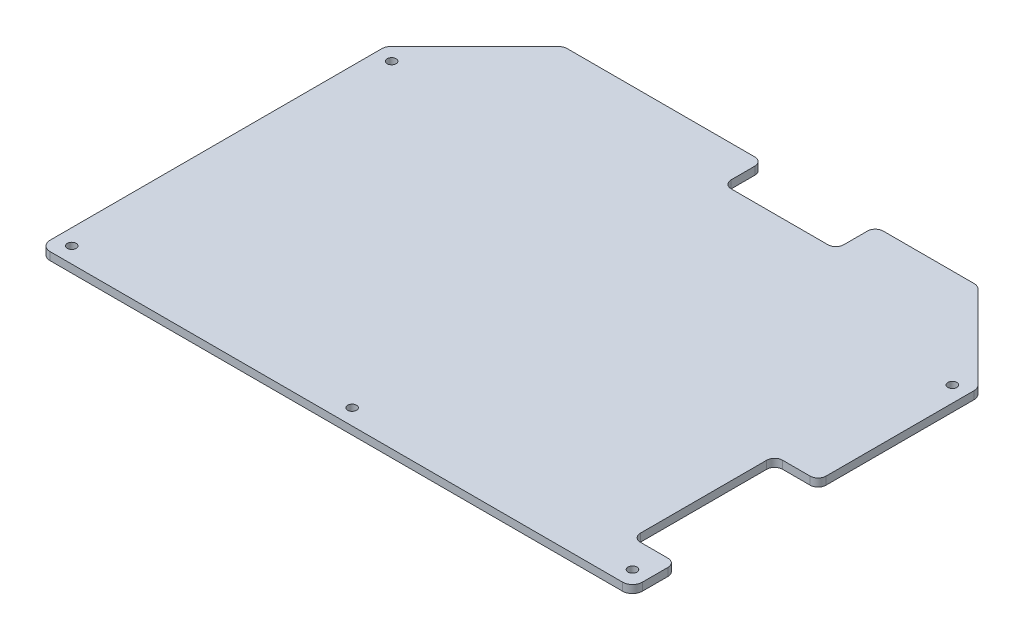
ISO-10303-21;
HEADER;
FILE_DESCRIPTION(('STEP AP214'),'2;1');
FILE_NAME('part.step','',(''),(''),'','','');
FILE_SCHEMA(('AUTOMOTIVE_DESIGN { 1 0 10303 214 1 1 1 1 }'));
ENDSEC;
DATA;
#1=APPLICATION_CONTEXT('core data for automotive mechanical design processes');
#2=APPLICATION_PROTOCOL_DEFINITION('international standard','automotive_design',2000,#1);
#3=PRODUCT_CONTEXT('',#1,'mechanical');
#4=PRODUCT('Part','Part','',(#3));
#5=PRODUCT_RELATED_PRODUCT_CATEGORY('part','',(#4));
#6=PRODUCT_DEFINITION_FORMATION('','',#4);
#7=PRODUCT_DEFINITION_CONTEXT('part definition',#1,'design');
#8=PRODUCT_DEFINITION('design','',#6,#7);
#9=PRODUCT_DEFINITION_SHAPE('','',#8);
#10=(LENGTH_UNIT() NAMED_UNIT(*) SI_UNIT(.MILLI.,.METRE.));
#11=(NAMED_UNIT(*) PLANE_ANGLE_UNIT() SI_UNIT($,.RADIAN.));
#12=(NAMED_UNIT(*) SI_UNIT($,.STERADIAN.) SOLID_ANGLE_UNIT());
#13=UNCERTAINTY_MEASURE_WITH_UNIT(LENGTH_MEASURE(1.E-05),#10,'distance_accuracy_value','');
#14=(GEOMETRIC_REPRESENTATION_CONTEXT(3) GLOBAL_UNCERTAINTY_ASSIGNED_CONTEXT((#13)) GLOBAL_UNIT_ASSIGNED_CONTEXT((#10,
#11,#12)) REPRESENTATION_CONTEXT('',''));
#15=CARTESIAN_POINT('',(0.,0.,0.));
#16=DIRECTION('',(0.,0.,1.));
#17=DIRECTION('',(1.,0.,0.));
#18=AXIS2_PLACEMENT_3D('',#15,#16,#17);
#19=CARTESIAN_POINT('',(105.,4.,-220.));
#20=DIRECTION('',(0.,0.,1.));
#21=DIRECTION('',(1.,0.,0.));
#22=AXIS2_PLACEMENT_3D('',#19,#20,#21);
#23=PLANE('',#22);
#24=DIRECTION('',(-1.,0.,0.));
#25=VECTOR('',#24,1.);
#26=CARTESIAN_POINT('',(105.,0.,-220.));
#27=LINE('',#26,#25);
#28=CARTESIAN_POINT('',(102.928932188135,0.,-220.));
#29=VERTEX_POINT('',#28);
#30=CARTESIAN_POINT('',(57.,0.,-220.));
#31=VERTEX_POINT('',#30);
#32=EDGE_CURVE('E564',#29,#31,#27,.T.);
#33=ORIENTED_EDGE('',*,*,#32,.T.);
#34=DIRECTION('',(0.,1.,0.));
#35=VECTOR('',#34,1.);
#36=CARTESIAN_POINT('',(57.,4.,-220.));
#37=LINE('',#36,#35);
#38=CARTESIAN_POINT('',(57.,4.,-220.));
#39=VERTEX_POINT('',#38);
#40=EDGE_CURVE('E335',#31,#39,#37,.T.);
#41=ORIENTED_EDGE('',*,*,#40,.T.);
#42=DIRECTION('',(-1.,0.,0.));
#43=VECTOR('',#42,1.);
#44=CARTESIAN_POINT('',(105.,4.,-220.));
#45=LINE('',#44,#43);
#46=CARTESIAN_POINT('',(102.928932188135,4.,-220.));
#47=VERTEX_POINT('',#46);
#48=EDGE_CURVE('E542',#47,#39,#45,.T.);
#49=ORIENTED_EDGE('',*,*,#48,.F.);
#50=DIRECTION('',(0.,-1.,0.));
#51=VECTOR('',#50,1.);
#52=CARTESIAN_POINT('',(102.928932188135,4.,-220.));
#53=LINE('',#52,#51);
#54=EDGE_CURVE('E324',#47,#29,#53,.T.);
#55=ORIENTED_EDGE('',*,*,#54,.T.);
#56=EDGE_LOOP('',(#33,#41,#49,#55));
#57=FACE_BOUND('',#56,.T.);
#58=ADVANCED_FACE('F38',(#57),#23,.F.);
#59=CARTESIAN_POINT('',(150.,4.,0.));
#60=DIRECTION('',(-1.,0.,0.));
#61=DIRECTION('',(0.,0.,1.));
#62=AXIS2_PLACEMENT_3D('',#59,#60,#61);
#63=PLANE('',#62);
#64=DIRECTION('',(0.,0.,-1.));
#65=VECTOR('',#64,1.);
#66=CARTESIAN_POINT('',(150.,0.,0.));
#67=LINE('',#66,#65);
#68=CARTESIAN_POINT('',(150.,0.,-5.));
#69=VERTEX_POINT('',#68);
#70=CARTESIAN_POINT('',(150.,0.,-18.));
#71=VERTEX_POINT('',#70);
#72=EDGE_CURVE('E555',#69,#71,#67,.T.);
#73=ORIENTED_EDGE('',*,*,#72,.T.);
#74=DIRECTION('',(0.,1.,0.));
#75=VECTOR('',#74,1.);
#76=CARTESIAN_POINT('',(150.,4.,-18.));
#77=LINE('',#76,#75);
#78=CARTESIAN_POINT('',(150.,4.,-18.));
#79=VERTEX_POINT('',#78);
#80=EDGE_CURVE('E378',#71,#79,#77,.T.);
#81=ORIENTED_EDGE('',*,*,#80,.T.);
#82=DIRECTION('',(0.,0.,-1.));
#83=VECTOR('',#82,1.);
#84=CARTESIAN_POINT('',(150.,4.,0.));
#85=LINE('',#84,#83);
#86=CARTESIAN_POINT('',(150.,4.,-5.));
#87=VERTEX_POINT('',#86);
#88=EDGE_CURVE('E260',#87,#79,#85,.T.);
#89=ORIENTED_EDGE('',*,*,#88,.F.);
#90=DIRECTION('',(0.,-1.,0.));
#91=VECTOR('',#90,1.);
#92=CARTESIAN_POINT('',(150.,4.,-5.));
#93=LINE('',#92,#91);
#94=EDGE_CURVE('E312',#87,#69,#93,.T.);
#95=ORIENTED_EDGE('',*,*,#94,.T.);
#96=EDGE_LOOP('',(#73,#81,#89,#95));
#97=FACE_BOUND('',#96,.T.);
#98=ADVANCED_FACE('F592',(#97),#63,.F.);
#99=CARTESIAN_POINT('',(150.,4.,-98.));
#100=VERTEX_POINT('',#99);
#101=CARTESIAN_POINT('',(150.,4.,-172.928932188135));
#102=VERTEX_POINT('',#101);
#103=EDGE_CURVE('E255',#100,#102,#85,.T.);
#104=ORIENTED_EDGE('',*,*,#103,.F.);
#105=DIRECTION('',(0.,1.,0.));
#106=VECTOR('',#105,1.);
#107=CARTESIAN_POINT('',(150.,4.,-98.));
#108=LINE('',#107,#106);
#109=CARTESIAN_POINT('',(150.,0.,-98.));
#110=VERTEX_POINT('',#109);
#111=EDGE_CURVE('E396',#100,#110,#108,.F.);
#112=ORIENTED_EDGE('',*,*,#111,.T.);
#113=CARTESIAN_POINT('',(150.,0.,-172.928932188135));
#114=VERTEX_POINT('',#113);
#115=EDGE_CURVE('E533',#110,#114,#67,.T.);
#116=ORIENTED_EDGE('',*,*,#115,.T.);
#117=DIRECTION('',(0.,-1.,0.));
#118=VECTOR('',#117,1.);
#119=CARTESIAN_POINT('',(150.,4.,-172.928932188135));
#120=LINE('',#119,#118);
#121=EDGE_CURVE('E316',#114,#102,#120,.F.);
#122=ORIENTED_EDGE('',*,*,#121,.T.);
#123=EDGE_LOOP('',(#104,#112,#116,#122));
#124=FACE_BOUND('',#123,.T.);
#125=ADVANCED_FACE('F598',(#124),#63,.F.);
#126=CARTESIAN_POINT('',(150.,4.,-175.));
#127=DIRECTION('',(-0.707106781186547,0.,0.707106781186548));
#128=DIRECTION('',(0.707106781186548,0.,0.707106781186547));
#129=AXIS2_PLACEMENT_3D('',#126,#127,#128);
#130=PLANE('',#129);
#131=DIRECTION('',(-0.707106781186548,0.,-0.707106781186547));
#132=VECTOR('',#131,1.);
#133=CARTESIAN_POINT('',(150.,4.,-175.));
#134=LINE('',#133,#132);
#135=CARTESIAN_POINT('',(148.535533905933,4.,-176.464466094067));
#136=VERTEX_POINT('',#135);
#137=CARTESIAN_POINT('',(106.464466094067,4.,-218.535533905933));
#138=VERTEX_POINT('',#137);
#139=EDGE_CURVE('E537',#136,#138,#134,.T.);
#140=ORIENTED_EDGE('',*,*,#139,.F.);
#141=DIRECTION('',(0.,-1.,0.));
#142=VECTOR('',#141,1.);
#143=CARTESIAN_POINT('',(148.535533905933,4.,-176.464466094067));
#144=LINE('',#143,#142);
#145=CARTESIAN_POINT('',(148.535533905933,0.,-176.464466094067));
#146=VERTEX_POINT('',#145);
#147=EDGE_CURVE('E308',#136,#146,#144,.T.);
#148=ORIENTED_EDGE('',*,*,#147,.T.);
#149=DIRECTION('',(-0.707106781186548,0.,-0.707106781186547));
#150=VECTOR('',#149,1.);
#151=CARTESIAN_POINT('',(150.,0.,-175.));
#152=LINE('',#151,#150);
#153=CARTESIAN_POINT('',(106.464466094067,0.,-218.535533905933));
#154=VERTEX_POINT('',#153);
#155=EDGE_CURVE('E559',#146,#154,#152,.T.);
#156=ORIENTED_EDGE('',*,*,#155,.T.);
#157=DIRECTION('',(0.,-1.,0.));
#158=VECTOR('',#157,1.);
#159=CARTESIAN_POINT('',(106.464466094067,4.,-218.535533905933));
#160=LINE('',#159,#158);
#161=EDGE_CURVE('E305',#154,#138,#160,.F.);
#162=ORIENTED_EDGE('',*,*,#161,.T.);
#163=EDGE_LOOP('',(#140,#148,#156,#162));
#164=FACE_BOUND('',#163,.T.);
#165=ADVANCED_FACE('F603',(#164),#130,.F.);
#166=CARTESIAN_POINT('',(-8.00000000000001,4.,-220.));
#167=VERTEX_POINT('',#166);
#168=CARTESIAN_POINT('',(-102.928932188135,4.,-220.));
#169=VERTEX_POINT('',#168);
#170=EDGE_CURVE('E541',#167,#169,#45,.T.);
#171=ORIENTED_EDGE('',*,*,#170,.F.);
#172=DIRECTION('',(0.,1.,0.));
#173=VECTOR('',#172,1.);
#174=CARTESIAN_POINT('',(-8.00000000000001,4.,-220.));
#175=LINE('',#174,#173);
#176=CARTESIAN_POINT('',(-8.00000000000001,0.,-220.));
#177=VERTEX_POINT('',#176);
#178=EDGE_CURVE('E375',#167,#177,#175,.F.);
#179=ORIENTED_EDGE('',*,*,#178,.T.);
#180=CARTESIAN_POINT('',(-102.928932188135,0.,-220.));
#181=VERTEX_POINT('',#180);
#182=EDGE_CURVE('E563',#177,#181,#27,.T.);
#183=ORIENTED_EDGE('',*,*,#182,.T.);
#184=DIRECTION('',(0.,-1.,0.));
#185=VECTOR('',#184,1.);
#186=CARTESIAN_POINT('',(-102.928932188135,4.,-220.));
#187=LINE('',#186,#185);
#188=EDGE_CURVE('E320',#181,#169,#187,.F.);
#189=ORIENTED_EDGE('',*,*,#188,.T.);
#190=EDGE_LOOP('',(#171,#179,#183,#189));
#191=FACE_BOUND('',#190,.T.);
#192=ADVANCED_FACE('F589',(#191),#23,.F.);
#193=CARTESIAN_POINT('',(-150.,4.,-175.));
#194=DIRECTION('',(0.707106781186547,0.,0.707106781186548));
#195=DIRECTION('',(0.707106781186548,0.,-0.707106781186547));
#196=AXIS2_PLACEMENT_3D('',#193,#194,#195);
#197=PLANE('',#196);
#198=DIRECTION('',(-0.707106781186548,0.,0.707106781186547));
#199=VECTOR('',#198,1.);
#200=CARTESIAN_POINT('',(-150.,4.,-175.));
#201=LINE('',#200,#199);
#202=CARTESIAN_POINT('',(-106.464466094067,4.,-218.535533905933));
#203=VERTEX_POINT('',#202);
#204=CARTESIAN_POINT('',(-148.535533905933,4.,-176.464466094067));
#205=VERTEX_POINT('',#204);
#206=EDGE_CURVE('E545',#203,#205,#201,.T.);
#207=ORIENTED_EDGE('',*,*,#206,.F.);
#208=DIRECTION('',(0.,-1.,0.));
#209=VECTOR('',#208,1.);
#210=CARTESIAN_POINT('',(-106.464466094067,4.,-218.535533905933));
#211=LINE('',#210,#209);
#212=CARTESIAN_POINT('',(-106.464466094067,0.,-218.535533905933));
#213=VERTEX_POINT('',#212);
#214=EDGE_CURVE('E331',#203,#213,#211,.T.);
#215=ORIENTED_EDGE('',*,*,#214,.T.);
#216=DIRECTION('',(-0.707106781186548,0.,0.707106781186547));
#217=VECTOR('',#216,1.);
#218=CARTESIAN_POINT('',(-150.,0.,-175.));
#219=LINE('',#218,#217);
#220=CARTESIAN_POINT('',(-148.535533905933,0.,-176.464466094067));
#221=VERTEX_POINT('',#220);
#222=EDGE_CURVE('E262',#213,#221,#219,.T.);
#223=ORIENTED_EDGE('',*,*,#222,.T.);
#224=DIRECTION('',(0.,-1.,0.));
#225=VECTOR('',#224,1.);
#226=CARTESIAN_POINT('',(-148.535533905933,4.,-176.464466094067));
#227=LINE('',#226,#225);
#228=EDGE_CURVE('E328',#221,#205,#227,.F.);
#229=ORIENTED_EDGE('',*,*,#228,.T.);
#230=EDGE_LOOP('',(#207,#215,#223,#229));
#231=FACE_BOUND('',#230,.T.);
#232=ADVANCED_FACE('F573',(#231),#197,.F.);
#233=CARTESIAN_POINT('',(-150.,4.,0.));
#234=DIRECTION('',(1.,0.,0.));
#235=DIRECTION('',(0.,0.,-1.));
#236=AXIS2_PLACEMENT_3D('',#233,#234,#235);
#237=PLANE('',#236);
#238=DIRECTION('',(0.,0.,1.));
#239=VECTOR('',#238,1.);
#240=CARTESIAN_POINT('',(-150.,0.,0.));
#241=LINE('',#240,#239);
#242=CARTESIAN_POINT('',(-150.,0.,-172.928932188135));
#243=VERTEX_POINT('',#242);
#244=CARTESIAN_POINT('',(-150.,0.,-5.));
#245=VERTEX_POINT('',#244);
#246=EDGE_CURVE('E256',#243,#245,#241,.T.);
#247=ORIENTED_EDGE('',*,*,#246,.T.);
#248=DIRECTION('',(0.,-1.,0.));
#249=VECTOR('',#248,1.);
#250=CARTESIAN_POINT('',(-150.,4.,-5.));
#251=LINE('',#250,#249);
#252=CARTESIAN_POINT('',(-150.,4.,-5.));
#253=VERTEX_POINT('',#252);
#254=EDGE_CURVE('E230',#245,#253,#251,.F.);
#255=ORIENTED_EDGE('',*,*,#254,.T.);
#256=DIRECTION('',(0.,0.,1.));
#257=VECTOR('',#256,1.);
#258=CARTESIAN_POINT('',(-150.,4.,0.));
#259=LINE('',#258,#257);
#260=CARTESIAN_POINT('',(-150.,4.,-172.928932188135));
#261=VERTEX_POINT('',#260);
#262=EDGE_CURVE('E549',#261,#253,#259,.T.);
#263=ORIENTED_EDGE('',*,*,#262,.F.);
#264=DIRECTION('',(0.,-1.,0.));
#265=VECTOR('',#264,1.);
#266=CARTESIAN_POINT('',(-150.,4.,-172.928932188135));
#267=LINE('',#266,#265);
#268=EDGE_CURVE('E235',#261,#243,#267,.T.);
#269=ORIENTED_EDGE('',*,*,#268,.T.);
#270=EDGE_LOOP('',(#247,#255,#263,#269));
#271=FACE_BOUND('',#270,.T.);
#272=ADVANCED_FACE('F581',(#271),#237,.F.);
#273=CARTESIAN_POINT('',(-150.,4.,0.));
#274=DIRECTION('',(0.,0.,-1.));
#275=DIRECTION('',(-1.,0.,0.));
#276=AXIS2_PLACEMENT_3D('',#273,#274,#275);
#277=PLANE('',#276);
#278=DIRECTION('',(1.,0.,0.));
#279=VECTOR('',#278,1.);
#280=CARTESIAN_POINT('',(-150.,4.,0.));
#281=LINE('',#280,#279);
#282=CARTESIAN_POINT('',(-145.,4.,0.));
#283=VERTEX_POINT('',#282);
#284=CARTESIAN_POINT('',(145.,4.,0.));
#285=VERTEX_POINT('',#284);
#286=EDGE_CURVE('E245',#283,#285,#281,.T.);
#287=ORIENTED_EDGE('',*,*,#286,.F.);
#288=DIRECTION('',(0.,-1.,0.));
#289=VECTOR('',#288,1.);
#290=CARTESIAN_POINT('',(-145.,4.,0.));
#291=LINE('',#290,#289);
#292=CARTESIAN_POINT('',(-145.,0.,0.));
#293=VERTEX_POINT('',#292);
#294=EDGE_CURVE('E229',#283,#293,#291,.T.);
#295=ORIENTED_EDGE('',*,*,#294,.T.);
#296=DIRECTION('',(1.,0.,0.));
#297=VECTOR('',#296,1.);
#298=CARTESIAN_POINT('',(-150.,0.,0.));
#299=LINE('',#298,#297);
#300=CARTESIAN_POINT('',(145.,0.,0.));
#301=VERTEX_POINT('',#300);
#302=EDGE_CURVE('E242',#293,#301,#299,.T.);
#303=ORIENTED_EDGE('',*,*,#302,.T.);
#304=DIRECTION('',(0.,-1.,0.));
#305=VECTOR('',#304,1.);
#306=CARTESIAN_POINT('',(145.,4.,0.));
#307=LINE('',#306,#305);
#308=EDGE_CURVE('E248',#301,#285,#307,.F.);
#309=ORIENTED_EDGE('',*,*,#308,.T.);
#310=EDGE_LOOP('',(#287,#295,#303,#309));
#311=FACE_BOUND('',#310,.T.);
#312=ADVANCED_FACE('F241',(#311),#277,.F.);
#313=CARTESIAN_POINT('',(0.,4.,0.));
#314=DIRECTION('',(0.,1.,0.));
#315=DIRECTION('',(0.,0.,1.));
#316=AXIS2_PLACEMENT_3D('',#313,#314,#315);
#317=PLANE('',#316);
#318=ORIENTED_EDGE('',*,*,#48,.T.);
#319=CARTESIAN_POINT('',(57.,4.,-216.));
#320=DIRECTION('',(0.,1.,0.));
#321=DIRECTION('',(0.,0.,1.));
#322=AXIS2_PLACEMENT_3D('',#319,#320,#321);
#323=CIRCLE('',#322,4.);
#324=CARTESIAN_POINT('',(53.,4.,-216.));
#325=VERTEX_POINT('',#324);
#326=EDGE_CURVE('E348',#39,#325,#323,.T.);
#327=ORIENTED_EDGE('',*,*,#326,.T.);
#328=DIRECTION('',(0.,0.,-1.));
#329=VECTOR('',#328,1.);
#330=CARTESIAN_POINT('',(53.,4.,-220.));
#331=LINE('',#330,#329);
#332=CARTESIAN_POINT('',(53.,4.,-204.));
#333=VERTEX_POINT('',#332);
#334=EDGE_CURVE('E445',#333,#325,#331,.T.);
#335=ORIENTED_EDGE('',*,*,#334,.F.);
#336=CARTESIAN_POINT('',(49.,4.,-204.));
#337=DIRECTION('',(0.,1.,0.));
#338=DIRECTION('',(0.,0.,1.));
#339=AXIS2_PLACEMENT_3D('',#336,#337,#338);
#340=CIRCLE('',#339,4.);
#341=CARTESIAN_POINT('',(49.,4.,-200.));
#342=VERTEX_POINT('',#341);
#343=EDGE_CURVE('E425',#333,#342,#340,.F.);
#344=ORIENTED_EDGE('',*,*,#343,.T.);
#345=DIRECTION('',(1.,0.,0.));
#346=VECTOR('',#345,1.);
#347=CARTESIAN_POINT('',(36.3,4.,-200.));
#348=LINE('',#347,#346);
#349=CARTESIAN_POINT('',(0.,4.,-200.));
#350=VERTEX_POINT('',#349);
#351=EDGE_CURVE('E439',#350,#342,#348,.T.);
#352=ORIENTED_EDGE('',*,*,#351,.F.);
#353=CARTESIAN_POINT('',(0.,4.,-204.));
#354=DIRECTION('',(0.,1.,0.));
#355=DIRECTION('',(0.,0.,1.));
#356=AXIS2_PLACEMENT_3D('',#353,#354,#355);
#357=CIRCLE('',#356,4.);
#358=CARTESIAN_POINT('',(-4.00000000000001,4.,-204.));
#359=VERTEX_POINT('',#358);
#360=EDGE_CURVE('E47',#350,#359,#357,.F.);
#361=ORIENTED_EDGE('',*,*,#360,.T.);
#362=DIRECTION('',(0.,0.,1.));
#363=VECTOR('',#362,1.);
#364=CARTESIAN_POINT('',(-4.00000000000001,4.,-220.));
#365=LINE('',#364,#363);
#366=CARTESIAN_POINT('',(-4.00000000000001,4.,-216.));
#367=VERTEX_POINT('',#366);
#368=EDGE_CURVE('E437',#367,#359,#365,.T.);
#369=ORIENTED_EDGE('',*,*,#368,.F.);
#370=CARTESIAN_POINT('',(-8.00000000000001,4.,-216.));
#371=DIRECTION('',(0.,1.,0.));
#372=DIRECTION('',(0.,0.,1.));
#373=AXIS2_PLACEMENT_3D('',#370,#371,#372);
#374=CIRCLE('',#373,4.);
#375=EDGE_CURVE('E345',#367,#167,#374,.T.);
#376=ORIENTED_EDGE('',*,*,#375,.T.);
#377=ORIENTED_EDGE('',*,*,#170,.T.);
#378=CARTESIAN_POINT('',(-102.928932188135,4.,-215.));
#379=DIRECTION('',(0.,1.,0.));
#380=DIRECTION('',(0.,0.,1.));
#381=AXIS2_PLACEMENT_3D('',#378,#379,#380);
#382=CIRCLE('',#381,5.);
#383=EDGE_CURVE('E290',#169,#203,#382,.T.);
#384=ORIENTED_EDGE('',*,*,#383,.T.);
#385=ORIENTED_EDGE('',*,*,#206,.T.);
#386=CARTESIAN_POINT('',(-145.,4.,-172.928932188135));
#387=DIRECTION('',(0.,1.,0.));
#388=DIRECTION('',(0.,0.,1.));
#389=AXIS2_PLACEMENT_3D('',#386,#387,#388);
#390=CIRCLE('',#389,5.);
#391=EDGE_CURVE('E287',#205,#261,#390,.T.);
#392=ORIENTED_EDGE('',*,*,#391,.T.);
#393=ORIENTED_EDGE('',*,*,#262,.T.);
#394=CARTESIAN_POINT('',(-145.,4.,-5.));
#395=DIRECTION('',(0.,1.,0.));
#396=DIRECTION('',(0.,0.,1.));
#397=AXIS2_PLACEMENT_3D('',#394,#395,#396);
#398=CIRCLE('',#397,5.);
#399=EDGE_CURVE('E302',#253,#283,#398,.T.);
#400=ORIENTED_EDGE('',*,*,#399,.T.);
#401=ORIENTED_EDGE('',*,*,#286,.T.);
#402=CARTESIAN_POINT('',(145.,4.,-5.));
#403=DIRECTION('',(0.,1.,0.));
#404=DIRECTION('',(0.,0.,1.));
#405=AXIS2_PLACEMENT_3D('',#402,#403,#404);
#406=CIRCLE('',#405,5.);
#407=EDGE_CURVE('E293',#285,#87,#406,.T.);
#408=ORIENTED_EDGE('',*,*,#407,.T.);
#409=ORIENTED_EDGE('',*,*,#88,.T.);
#410=CARTESIAN_POINT('',(146.,4.,-18.));
#411=DIRECTION('',(0.,1.,0.));
#412=DIRECTION('',(0.,0.,1.));
#413=AXIS2_PLACEMENT_3D('',#410,#411,#412);
#414=CIRCLE('',#413,4.);
#415=CARTESIAN_POINT('',(146.,4.,-22.));
#416=VERTEX_POINT('',#415);
#417=EDGE_CURVE('E342',#79,#416,#414,.T.);
#418=ORIENTED_EDGE('',*,*,#417,.T.);
#419=DIRECTION('',(1.,0.,0.));
#420=VECTOR('',#419,1.);
#421=CARTESIAN_POINT('',(128.,4.,-22.));
#422=LINE('',#421,#420);
#423=CARTESIAN_POINT('',(132.,4.,-22.));
#424=VERTEX_POINT('',#423);
#425=EDGE_CURVE('E476',#424,#416,#422,.T.);
#426=ORIENTED_EDGE('',*,*,#425,.F.);
#427=CARTESIAN_POINT('',(132.,4.,-26.));
#428=DIRECTION('',(0.,1.,0.));
#429=DIRECTION('',(0.,0.,1.));
#430=AXIS2_PLACEMENT_3D('',#427,#428,#429);
#431=CIRCLE('',#430,4.);
#432=CARTESIAN_POINT('',(128.,4.,-26.));
#433=VERTEX_POINT('',#432);
#434=EDGE_CURVE('E413',#424,#433,#431,.F.);
#435=ORIENTED_EDGE('',*,*,#434,.T.);
#436=DIRECTION('',(0.,0.,1.));
#437=VECTOR('',#436,1.);
#438=CARTESIAN_POINT('',(128.,4.,-94.));
#439=LINE('',#438,#437);
#440=CARTESIAN_POINT('',(128.,4.,-90.));
#441=VERTEX_POINT('',#440);
#442=EDGE_CURVE('E484',#441,#433,#439,.T.);
#443=ORIENTED_EDGE('',*,*,#442,.F.);
#444=CARTESIAN_POINT('',(132.,4.,-90.));
#445=DIRECTION('',(0.,1.,0.));
#446=DIRECTION('',(0.,0.,1.));
#447=AXIS2_PLACEMENT_3D('',#444,#445,#446);
#448=CIRCLE('',#447,4.);
#449=CARTESIAN_POINT('',(132.,4.,-94.));
#450=VERTEX_POINT('',#449);
#451=EDGE_CURVE('E419',#441,#450,#448,.F.);
#452=ORIENTED_EDGE('',*,*,#451,.T.);
#453=DIRECTION('',(-1.,0.,0.));
#454=VECTOR('',#453,1.);
#455=CARTESIAN_POINT('',(128.,4.,-94.));
#456=LINE('',#455,#454);
#457=CARTESIAN_POINT('',(146.,4.,-94.));
#458=VERTEX_POINT('',#457);
#459=EDGE_CURVE('E462',#458,#450,#456,.T.);
#460=ORIENTED_EDGE('',*,*,#459,.F.);
#461=CARTESIAN_POINT('',(146.,4.,-98.));
#462=DIRECTION('',(0.,1.,0.));
#463=DIRECTION('',(0.,0.,1.));
#464=AXIS2_PLACEMENT_3D('',#461,#462,#463);
#465=CIRCLE('',#464,4.);
#466=EDGE_CURVE('E339',#458,#100,#465,.T.);
#467=ORIENTED_EDGE('',*,*,#466,.T.);
#468=ORIENTED_EDGE('',*,*,#103,.T.);
#469=CARTESIAN_POINT('',(145.,4.,-172.928932188135));
#470=DIRECTION('',(0.,1.,0.));
#471=DIRECTION('',(0.,0.,1.));
#472=AXIS2_PLACEMENT_3D('',#469,#470,#471);
#473=CIRCLE('',#472,5.);
#474=EDGE_CURVE('E299',#102,#136,#473,.T.);
#475=ORIENTED_EDGE('',*,*,#474,.T.);
#476=ORIENTED_EDGE('',*,*,#139,.T.);
#477=CARTESIAN_POINT('',(102.928932188135,4.,-215.));
#478=DIRECTION('',(0.,1.,0.));
#479=DIRECTION('',(0.,0.,1.));
#480=AXIS2_PLACEMENT_3D('',#477,#478,#479);
#481=CIRCLE('',#480,5.);
#482=EDGE_CURVE('E296',#138,#47,#481,.T.);
#483=ORIENTED_EDGE('',*,*,#482,.T.);
#484=EDGE_LOOP('',(#318,#327,#335,#344,#352,#361,#369,#376,#377,#384,#385,#392,#393,#400,#401,
#408,#409,#418,#426,#435,#443,#452,#460,#467,#468,#475,#476,#483));
#485=FACE_BOUND('',#484,.T.);
#486=CARTESIAN_POINT('',(-142.,4.,-8.00000000000001));
#487=DIRECTION('',(0.,1.,0.));
#488=DIRECTION('',(0.,0.,1.));
#489=AXIS2_PLACEMENT_3D('',#486,#487,#488);
#490=CIRCLE('',#489,2.25);
#491=CARTESIAN_POINT('',(-142.,4.,-5.75000000000001));
#492=VERTEX_POINT('',#491);
#493=EDGE_CURVE('E494',#492,#492,#490,.T.);
#494=ORIENTED_EDGE('',*,*,#493,.F.);
#495=EDGE_LOOP('',(#494));
#496=FACE_BOUND('',#495,.T.);
#497=CARTESIAN_POINT('',(-142.,4.,-170.));
#498=DIRECTION('',(0.,1.,0.));
#499=DIRECTION('',(0.,0.,1.));
#500=AXIS2_PLACEMENT_3D('',#497,#498,#499);
#501=CIRCLE('',#500,2.25);
#502=CARTESIAN_POINT('',(-142.,4.,-167.75));
#503=VERTEX_POINT('',#502);
#504=EDGE_CURVE('E502',#503,#503,#501,.T.);
#505=ORIENTED_EDGE('',*,*,#504,.F.);
#506=EDGE_LOOP('',(#505));
#507=FACE_BOUND('',#506,.T.);
#508=CARTESIAN_POINT('',(142.,4.,-170.));
#509=DIRECTION('',(0.,1.,0.));
#510=DIRECTION('',(0.,0.,1.));
#511=AXIS2_PLACEMENT_3D('',#508,#509,#510);
#512=CIRCLE('',#511,2.25);
#513=CARTESIAN_POINT('',(142.,4.,-167.75));
#514=VERTEX_POINT('',#513);
#515=EDGE_CURVE('E510',#514,#514,#512,.T.);
#516=ORIENTED_EDGE('',*,*,#515,.F.);
#517=EDGE_LOOP('',(#516));
#518=FACE_BOUND('',#517,.T.);
#519=CARTESIAN_POINT('',(142.,4.,-8.));
#520=DIRECTION('',(0.,1.,0.));
#521=DIRECTION('',(0.,0.,1.));
#522=AXIS2_PLACEMENT_3D('',#519,#520,#521);
#523=CIRCLE('',#522,2.25);
#524=CARTESIAN_POINT('',(142.,4.,-5.75));
#525=VERTEX_POINT('',#524);
#526=EDGE_CURVE('E518',#525,#525,#523,.T.);
#527=ORIENTED_EDGE('',*,*,#526,.F.);
#528=EDGE_LOOP('',(#527));
#529=FACE_BOUND('',#528,.T.);
#530=CARTESIAN_POINT('',(0.,4.,-8.));
#531=DIRECTION('',(0.,1.,0.));
#532=DIRECTION('',(0.,0.,1.));
#533=AXIS2_PLACEMENT_3D('',#530,#531,#532);
#534=CIRCLE('',#533,2.24999999999999);
#535=CARTESIAN_POINT('',(0.,4.,-5.75000000000001));
#536=VERTEX_POINT('',#535);
#537=EDGE_CURVE('E526',#536,#536,#534,.T.);
#538=ORIENTED_EDGE('',*,*,#537,.F.);
#539=EDGE_LOOP('',(#538));
#540=FACE_BOUND('',#539,.T.);
#541=ADVANCED_FACE('F435',(#485,#496,#507,#518,#529,#540),#317,.T.);
#542=CARTESIAN_POINT('',(0.,0.,0.));
#543=DIRECTION('',(0.,1.,0.));
#544=DIRECTION('',(0.,0.,1.));
#545=AXIS2_PLACEMENT_3D('',#542,#543,#544);
#546=PLANE('',#545);
#547=CARTESIAN_POINT('',(-142.,0.,-8.00000000000001));
#548=DIRECTION('',(0.,1.,0.));
#549=DIRECTION('',(0.,0.,1.));
#550=AXIS2_PLACEMENT_3D('',#547,#548,#549);
#551=CIRCLE('',#550,2.24999999999997);
#552=CARTESIAN_POINT('',(-142.,0.,-5.75000000000003));
#553=VERTEX_POINT('',#552);
#554=EDGE_CURVE('E498',#553,#553,#551,.T.);
#555=ORIENTED_EDGE('',*,*,#554,.T.);
#556=EDGE_LOOP('',(#555));
#557=FACE_BOUND('',#556,.T.);
#558=CARTESIAN_POINT('',(-142.,0.,-170.));
#559=DIRECTION('',(0.,1.,0.));
#560=DIRECTION('',(0.,0.,1.));
#561=AXIS2_PLACEMENT_3D('',#558,#559,#560);
#562=CIRCLE('',#561,2.24999999999997);
#563=CARTESIAN_POINT('',(-142.,0.,-167.75));
#564=VERTEX_POINT('',#563);
#565=EDGE_CURVE('E506',#564,#564,#562,.T.);
#566=ORIENTED_EDGE('',*,*,#565,.T.);
#567=EDGE_LOOP('',(#566));
#568=FACE_BOUND('',#567,.T.);
#569=CARTESIAN_POINT('',(142.,0.,-170.));
#570=DIRECTION('',(0.,1.,0.));
#571=DIRECTION('',(0.,0.,1.));
#572=AXIS2_PLACEMENT_3D('',#569,#570,#571);
#573=CIRCLE('',#572,2.24999999999997);
#574=CARTESIAN_POINT('',(142.,0.,-167.75));
#575=VERTEX_POINT('',#574);
#576=EDGE_CURVE('E514',#575,#575,#573,.T.);
#577=ORIENTED_EDGE('',*,*,#576,.T.);
#578=EDGE_LOOP('',(#577));
#579=FACE_BOUND('',#578,.T.);
#580=CARTESIAN_POINT('',(142.,0.,-8.));
#581=DIRECTION('',(0.,1.,0.));
#582=DIRECTION('',(0.,0.,1.));
#583=AXIS2_PLACEMENT_3D('',#580,#581,#582);
#584=CIRCLE('',#583,2.24999999999997);
#585=CARTESIAN_POINT('',(142.,0.,-5.75000000000003));
#586=VERTEX_POINT('',#585);
#587=EDGE_CURVE('E522',#586,#586,#584,.T.);
#588=ORIENTED_EDGE('',*,*,#587,.T.);
#589=EDGE_LOOP('',(#588));
#590=FACE_BOUND('',#589,.T.);
#591=CARTESIAN_POINT('',(0.,0.,-8.));
#592=DIRECTION('',(0.,1.,0.));
#593=DIRECTION('',(0.,0.,1.));
#594=AXIS2_PLACEMENT_3D('',#591,#592,#593);
#595=CIRCLE('',#594,2.24999999999999);
#596=CARTESIAN_POINT('',(0.,0.,-5.75000000000001));
#597=VERTEX_POINT('',#596);
#598=EDGE_CURVE('E530',#597,#597,#595,.T.);
#599=ORIENTED_EDGE('',*,*,#598,.T.);
#600=EDGE_LOOP('',(#599));
#601=FACE_BOUND('',#600,.T.);
#602=DIRECTION('',(0.,0.,1.));
#603=VECTOR('',#602,1.);
#604=CARTESIAN_POINT('',(53.,0.,-220.));
#605=LINE('',#604,#603);
#606=CARTESIAN_POINT('',(53.,0.,-216.));
#607=VERTEX_POINT('',#606);
#608=CARTESIAN_POINT('',(53.,0.,-204.));
#609=VERTEX_POINT('',#608);
#610=EDGE_CURVE('E457',#607,#609,#605,.T.);
#611=ORIENTED_EDGE('',*,*,#610,.F.);
#612=CARTESIAN_POINT('',(57.,0.,-216.));
#613=DIRECTION('',(0.,1.,0.));
#614=DIRECTION('',(0.,0.,1.));
#615=AXIS2_PLACEMENT_3D('',#612,#613,#614);
#616=CIRCLE('',#615,4.);
#617=EDGE_CURVE('E366',#607,#31,#616,.F.);
#618=ORIENTED_EDGE('',*,*,#617,.T.);
#619=ORIENTED_EDGE('',*,*,#32,.F.);
#620=CARTESIAN_POINT('',(102.928932188135,0.,-215.));
#621=DIRECTION('',(0.,1.,0.));
#622=DIRECTION('',(0.,0.,1.));
#623=AXIS2_PLACEMENT_3D('',#620,#621,#622);
#624=CIRCLE('',#623,5.);
#625=EDGE_CURVE('E276',#29,#154,#624,.F.);
#626=ORIENTED_EDGE('',*,*,#625,.T.);
#627=ORIENTED_EDGE('',*,*,#155,.F.);
#628=CARTESIAN_POINT('',(145.,0.,-172.928932188135));
#629=DIRECTION('',(0.,1.,0.));
#630=DIRECTION('',(0.,0.,1.));
#631=AXIS2_PLACEMENT_3D('',#628,#629,#630);
#632=CIRCLE('',#631,5.);
#633=EDGE_CURVE('E236',#146,#114,#632,.F.);
#634=ORIENTED_EDGE('',*,*,#633,.T.);
#635=ORIENTED_EDGE('',*,*,#115,.F.);
#636=CARTESIAN_POINT('',(146.,0.,-98.));
#637=DIRECTION('',(0.,1.,0.));
#638=DIRECTION('',(0.,0.,1.));
#639=AXIS2_PLACEMENT_3D('',#636,#637,#638);
#640=CIRCLE('',#639,4.);
#641=CARTESIAN_POINT('',(146.,0.,-94.));
#642=VERTEX_POINT('',#641);
#643=EDGE_CURVE('E358',#110,#642,#640,.F.);
#644=ORIENTED_EDGE('',*,*,#643,.T.);
#645=DIRECTION('',(1.,0.,0.));
#646=VECTOR('',#645,1.);
#647=CARTESIAN_POINT('',(128.,0.,-94.));
#648=LINE('',#647,#646);
#649=CARTESIAN_POINT('',(132.,0.,-94.));
#650=VERTEX_POINT('',#649);
#651=EDGE_CURVE('E480',#650,#642,#648,.T.);
#652=ORIENTED_EDGE('',*,*,#651,.F.);
#653=CARTESIAN_POINT('',(132.,0.,-90.));
#654=DIRECTION('',(0.,1.,0.));
#655=DIRECTION('',(0.,0.,1.));
#656=AXIS2_PLACEMENT_3D('',#653,#654,#655);
#657=CIRCLE('',#656,4.);
#658=CARTESIAN_POINT('',(128.,0.,-90.));
#659=VERTEX_POINT('',#658);
#660=EDGE_CURVE('E422',#650,#659,#657,.T.);
#661=ORIENTED_EDGE('',*,*,#660,.T.);
#662=DIRECTION('',(0.,0.,-1.));
#663=VECTOR('',#662,1.);
#664=CARTESIAN_POINT('',(128.,0.,-94.));
#665=LINE('',#664,#663);
#666=CARTESIAN_POINT('',(128.,0.,-26.));
#667=VERTEX_POINT('',#666);
#668=EDGE_CURVE('E471',#667,#659,#665,.T.);
#669=ORIENTED_EDGE('',*,*,#668,.F.);
#670=CARTESIAN_POINT('',(132.,0.,-26.));
#671=DIRECTION('',(0.,1.,0.));
#672=DIRECTION('',(0.,0.,1.));
#673=AXIS2_PLACEMENT_3D('',#670,#671,#672);
#674=CIRCLE('',#673,4.);
#675=CARTESIAN_POINT('',(132.,0.,-22.));
#676=VERTEX_POINT('',#675);
#677=EDGE_CURVE('E416',#667,#676,#674,.T.);
#678=ORIENTED_EDGE('',*,*,#677,.T.);
#679=DIRECTION('',(-1.,0.,0.));
#680=VECTOR('',#679,1.);
#681=CARTESIAN_POINT('',(128.,0.,-22.));
#682=LINE('',#681,#680);
#683=CARTESIAN_POINT('',(146.,0.,-22.));
#684=VERTEX_POINT('',#683);
#685=EDGE_CURVE('E475',#684,#676,#682,.T.);
#686=ORIENTED_EDGE('',*,*,#685,.F.);
#687=CARTESIAN_POINT('',(146.,0.,-18.));
#688=DIRECTION('',(0.,1.,0.));
#689=DIRECTION('',(0.,0.,1.));
#690=AXIS2_PLACEMENT_3D('',#687,#688,#689);
#691=CIRCLE('',#690,4.);
#692=EDGE_CURVE('E361',#684,#71,#691,.F.);
#693=ORIENTED_EDGE('',*,*,#692,.T.);
#694=ORIENTED_EDGE('',*,*,#72,.F.);
#695=CARTESIAN_POINT('',(145.,0.,-5.));
#696=DIRECTION('',(0.,1.,0.));
#697=DIRECTION('',(0.,0.,1.));
#698=AXIS2_PLACEMENT_3D('',#695,#696,#697);
#699=CIRCLE('',#698,5.);
#700=EDGE_CURVE('E253',#69,#301,#699,.F.);
#701=ORIENTED_EDGE('',*,*,#700,.T.);
#702=ORIENTED_EDGE('',*,*,#302,.F.);
#703=CARTESIAN_POINT('',(-145.,0.,-5.));
#704=DIRECTION('',(0.,1.,0.));
#705=DIRECTION('',(0.,0.,1.));
#706=AXIS2_PLACEMENT_3D('',#703,#704,#705);
#707=CIRCLE('',#706,5.);
#708=EDGE_CURVE('E225',#293,#245,#707,.F.);
#709=ORIENTED_EDGE('',*,*,#708,.T.);
#710=ORIENTED_EDGE('',*,*,#246,.F.);
#711=CARTESIAN_POINT('',(-145.,0.,-172.928932188135));
#712=DIRECTION('',(0.,1.,0.));
#713=DIRECTION('',(0.,0.,1.));
#714=AXIS2_PLACEMENT_3D('',#711,#712,#713);
#715=CIRCLE('',#714,5.);
#716=EDGE_CURVE('E247',#243,#221,#715,.F.);
#717=ORIENTED_EDGE('',*,*,#716,.T.);
#718=ORIENTED_EDGE('',*,*,#222,.F.);
#719=CARTESIAN_POINT('',(-102.928932188135,0.,-215.));
#720=DIRECTION('',(0.,1.,0.));
#721=DIRECTION('',(0.,0.,1.));
#722=AXIS2_PLACEMENT_3D('',#719,#720,#721);
#723=CIRCLE('',#722,5.);
#724=EDGE_CURVE('E270',#213,#181,#723,.F.);
#725=ORIENTED_EDGE('',*,*,#724,.T.);
#726=ORIENTED_EDGE('',*,*,#182,.F.);
#727=CARTESIAN_POINT('',(-8.00000000000001,0.,-216.));
#728=DIRECTION('',(0.,1.,0.));
#729=DIRECTION('',(0.,0.,1.));
#730=AXIS2_PLACEMENT_3D('',#727,#728,#729);
#731=CIRCLE('',#730,4.);
#732=CARTESIAN_POINT('',(-4.00000000000001,0.,-216.));
#733=VERTEX_POINT('',#732);
#734=EDGE_CURVE('E54',#177,#733,#731,.F.);
#735=ORIENTED_EDGE('',*,*,#734,.T.);
#736=DIRECTION('',(0.,0.,-1.));
#737=VECTOR('',#736,1.);
#738=CARTESIAN_POINT('',(-4.00000000000001,0.,-220.));
#739=LINE('',#738,#737);
#740=CARTESIAN_POINT('',(-4.00000000000001,0.,-204.));
#741=VERTEX_POINT('',#740);
#742=EDGE_CURVE('E452',#741,#733,#739,.T.);
#743=ORIENTED_EDGE('',*,*,#742,.F.);
#744=CARTESIAN_POINT('',(0.,0.,-204.));
#745=DIRECTION('',(0.,1.,0.));
#746=DIRECTION('',(0.,0.,1.));
#747=AXIS2_PLACEMENT_3D('',#744,#745,#746);
#748=CIRCLE('',#747,4.);
#749=CARTESIAN_POINT('',(0.,0.,-200.));
#750=VERTEX_POINT('',#749);
#751=EDGE_CURVE('E11',#741,#750,#748,.T.);
#752=ORIENTED_EDGE('',*,*,#751,.T.);
#753=DIRECTION('',(-1.,0.,0.));
#754=VECTOR('',#753,1.);
#755=CARTESIAN_POINT('',(36.3,0.,-200.));
#756=LINE('',#755,#754);
#757=CARTESIAN_POINT('',(49.,0.,-200.));
#758=VERTEX_POINT('',#757);
#759=EDGE_CURVE('E450',#758,#750,#756,.T.);
#760=ORIENTED_EDGE('',*,*,#759,.F.);
#761=CARTESIAN_POINT('',(49.,0.,-204.));
#762=DIRECTION('',(0.,1.,0.));
#763=DIRECTION('',(0.,0.,1.));
#764=AXIS2_PLACEMENT_3D('',#761,#762,#763);
#765=CIRCLE('',#764,4.);
#766=EDGE_CURVE('E428',#758,#609,#765,.T.);
#767=ORIENTED_EDGE('',*,*,#766,.T.);
#768=EDGE_LOOP('',(#611,#618,#619,#626,#627,#634,#635,#644,#652,#661,#669,#678,#686,#693,#694,
#701,#702,#709,#710,#717,#718,#725,#726,#735,#743,#752,#760,#767));
#769=FACE_BOUND('',#768,.T.);
#770=ADVANCED_FACE('F251',(#557,#568,#579,#590,#601,#769),#546,.F.);
#771=CARTESIAN_POINT('',(-145.,4.,-5.));
#772=DIRECTION('',(0.,-1.,0.));
#773=DIRECTION('',(0.,0.,-1.));
#774=AXIS2_PLACEMENT_3D('',#771,#772,#773);
#775=CYLINDRICAL_SURFACE('',#774,5.);
#776=ORIENTED_EDGE('',*,*,#399,.F.);
#777=ORIENTED_EDGE('',*,*,#254,.F.);
#778=ORIENTED_EDGE('',*,*,#708,.F.);
#779=ORIENTED_EDGE('',*,*,#294,.F.);
#780=EDGE_LOOP('',(#776,#777,#778,#779));
#781=FACE_BOUND('',#780,.T.);
#782=ADVANCED_FACE('F228',(#781),#775,.T.);
#783=CARTESIAN_POINT('',(145.,4.,-172.928932188135));
#784=DIRECTION('',(0.,-1.,0.));
#785=DIRECTION('',(0.,0.,-1.));
#786=AXIS2_PLACEMENT_3D('',#783,#784,#785);
#787=CYLINDRICAL_SURFACE('',#786,5.);
#788=ORIENTED_EDGE('',*,*,#474,.F.);
#789=ORIENTED_EDGE('',*,*,#121,.F.);
#790=ORIENTED_EDGE('',*,*,#633,.F.);
#791=ORIENTED_EDGE('',*,*,#147,.F.);
#792=EDGE_LOOP('',(#788,#789,#790,#791));
#793=FACE_BOUND('',#792,.T.);
#794=ADVANCED_FACE('F666',(#793),#787,.T.);
#795=CARTESIAN_POINT('',(102.928932188135,4.,-215.));
#796=DIRECTION('',(0.,-1.,0.));
#797=DIRECTION('',(0.,0.,-1.));
#798=AXIS2_PLACEMENT_3D('',#795,#796,#797);
#799=CYLINDRICAL_SURFACE('',#798,5.);
#800=ORIENTED_EDGE('',*,*,#482,.F.);
#801=ORIENTED_EDGE('',*,*,#161,.F.);
#802=ORIENTED_EDGE('',*,*,#625,.F.);
#803=ORIENTED_EDGE('',*,*,#54,.F.);
#804=EDGE_LOOP('',(#800,#801,#802,#803));
#805=FACE_BOUND('',#804,.T.);
#806=ADVANCED_FACE('F659',(#805),#799,.T.);
#807=CARTESIAN_POINT('',(145.,4.,-5.));
#808=DIRECTION('',(0.,-1.,0.));
#809=DIRECTION('',(0.,0.,-1.));
#810=AXIS2_PLACEMENT_3D('',#807,#808,#809);
#811=CYLINDRICAL_SURFACE('',#810,5.);
#812=ORIENTED_EDGE('',*,*,#407,.F.);
#813=ORIENTED_EDGE('',*,*,#308,.F.);
#814=ORIENTED_EDGE('',*,*,#700,.F.);
#815=ORIENTED_EDGE('',*,*,#94,.F.);
#816=EDGE_LOOP('',(#812,#813,#814,#815));
#817=FACE_BOUND('',#816,.T.);
#818=ADVANCED_FACE('F700',(#817),#811,.T.);
#819=CARTESIAN_POINT('',(-102.928932188135,4.,-215.));
#820=DIRECTION('',(0.,-1.,0.));
#821=DIRECTION('',(0.,0.,-1.));
#822=AXIS2_PLACEMENT_3D('',#819,#820,#821);
#823=CYLINDRICAL_SURFACE('',#822,5.);
#824=ORIENTED_EDGE('',*,*,#383,.F.);
#825=ORIENTED_EDGE('',*,*,#188,.F.);
#826=ORIENTED_EDGE('',*,*,#724,.F.);
#827=ORIENTED_EDGE('',*,*,#214,.F.);
#828=EDGE_LOOP('',(#824,#825,#826,#827));
#829=FACE_BOUND('',#828,.T.);
#830=ADVANCED_FACE('F702',(#829),#823,.T.);
#831=CARTESIAN_POINT('',(-145.,4.,-172.928932188135));
#832=DIRECTION('',(0.,-1.,0.));
#833=DIRECTION('',(0.,0.,-1.));
#834=AXIS2_PLACEMENT_3D('',#831,#832,#833);
#835=CYLINDRICAL_SURFACE('',#834,5.);
#836=ORIENTED_EDGE('',*,*,#391,.F.);
#837=ORIENTED_EDGE('',*,*,#228,.F.);
#838=ORIENTED_EDGE('',*,*,#716,.F.);
#839=ORIENTED_EDGE('',*,*,#268,.F.);
#840=EDGE_LOOP('',(#836,#837,#838,#839));
#841=FACE_BOUND('',#840,.T.);
#842=ADVANCED_FACE('F577',(#841),#835,.T.);
#843=CARTESIAN_POINT('',(0.,4.,-8.));
#844=DIRECTION('',(0.,1.,0.));
#845=DIRECTION('',(0.,0.,1.));
#846=AXIS2_PLACEMENT_3D('',#843,#844,#845);
#847=CYLINDRICAL_SURFACE('',#846,2.24999999999999);
#848=ORIENTED_EDGE('',*,*,#598,.F.);
#849=EDGE_LOOP('',(#848));
#850=FACE_BOUND('',#849,.T.);
#851=ORIENTED_EDGE('',*,*,#537,.T.);
#852=EDGE_LOOP('',(#851));
#853=FACE_BOUND('',#852,.T.);
#854=ADVANCED_FACE('F713',(#850,#853),#847,.F.);
#855=CARTESIAN_POINT('',(142.,4.,-8.));
#856=DIRECTION('',(0.,1.,0.));
#857=DIRECTION('',(0.,0.,1.));
#858=AXIS2_PLACEMENT_3D('',#855,#856,#857);
#859=CYLINDRICAL_SURFACE('',#858,2.24999999999999);
#860=ORIENTED_EDGE('',*,*,#587,.F.);
#861=EDGE_LOOP('',(#860));
#862=FACE_BOUND('',#861,.T.);
#863=ORIENTED_EDGE('',*,*,#526,.T.);
#864=EDGE_LOOP('',(#863));
#865=FACE_BOUND('',#864,.T.);
#866=ADVANCED_FACE('F717',(#862,#865),#859,.F.);
#867=CARTESIAN_POINT('',(142.,4.,-170.));
#868=DIRECTION('',(0.,1.,0.));
#869=DIRECTION('',(0.,0.,1.));
#870=AXIS2_PLACEMENT_3D('',#867,#868,#869);
#871=CYLINDRICAL_SURFACE('',#870,2.24999999999999);
#872=ORIENTED_EDGE('',*,*,#576,.F.);
#873=EDGE_LOOP('',(#872));
#874=FACE_BOUND('',#873,.T.);
#875=ORIENTED_EDGE('',*,*,#515,.T.);
#876=EDGE_LOOP('',(#875));
#877=FACE_BOUND('',#876,.T.);
#878=ADVANCED_FACE('F723',(#874,#877),#871,.F.);
#879=CARTESIAN_POINT('',(-142.,4.,-170.));
#880=DIRECTION('',(0.,1.,0.));
#881=DIRECTION('',(0.,0.,1.));
#882=AXIS2_PLACEMENT_3D('',#879,#880,#881);
#883=CYLINDRICAL_SURFACE('',#882,2.24999999999999);
#884=ORIENTED_EDGE('',*,*,#565,.F.);
#885=EDGE_LOOP('',(#884));
#886=FACE_BOUND('',#885,.T.);
#887=ORIENTED_EDGE('',*,*,#504,.T.);
#888=EDGE_LOOP('',(#887));
#889=FACE_BOUND('',#888,.T.);
#890=ADVANCED_FACE('F754',(#886,#889),#883,.F.);
#891=CARTESIAN_POINT('',(-142.,4.,-8.00000000000001));
#892=DIRECTION('',(0.,1.,0.));
#893=DIRECTION('',(0.,0.,1.));
#894=AXIS2_PLACEMENT_3D('',#891,#892,#893);
#895=CYLINDRICAL_SURFACE('',#894,2.24999999999999);
#896=ORIENTED_EDGE('',*,*,#554,.F.);
#897=EDGE_LOOP('',(#896));
#898=FACE_BOUND('',#897,.T.);
#899=ORIENTED_EDGE('',*,*,#493,.T.);
#900=EDGE_LOOP('',(#899));
#901=FACE_BOUND('',#900,.T.);
#902=ADVANCED_FACE('F760',(#898,#901),#895,.F.);
#903=CARTESIAN_POINT('',(128.,-75.2861208988748,-22.));
#904=DIRECTION('',(0.,0.,1.));
#905=DIRECTION('',(1.,0.,0.));
#906=AXIS2_PLACEMENT_3D('',#903,#904,#905);
#907=PLANE('',#906);
#908=ORIENTED_EDGE('',*,*,#425,.T.);
#909=DIRECTION('',(0.,1.,0.));
#910=VECTOR('',#909,1.);
#911=CARTESIAN_POINT('',(146.,-75.2861208988748,-22.));
#912=LINE('',#911,#910);
#913=EDGE_CURVE('E386',#416,#684,#912,.F.);
#914=ORIENTED_EDGE('',*,*,#913,.T.);
#915=ORIENTED_EDGE('',*,*,#685,.T.);
#916=DIRECTION('',(0.,1.,0.));
#917=VECTOR('',#916,1.);
#918=CARTESIAN_POINT('',(132.,4.,-22.));
#919=LINE('',#918,#917);
#920=EDGE_CURVE('E382',#676,#424,#919,.T.);
#921=ORIENTED_EDGE('',*,*,#920,.T.);
#922=EDGE_LOOP('',(#908,#914,#915,#921));
#923=FACE_BOUND('',#922,.T.);
#924=ADVANCED_FACE('F692',(#923),#907,.F.);
#925=CARTESIAN_POINT('',(128.,-75.2861208988748,-94.));
#926=DIRECTION('',(-1.,0.,0.));
#927=DIRECTION('',(0.,0.,1.));
#928=AXIS2_PLACEMENT_3D('',#925,#926,#927);
#929=PLANE('',#928);
#930=ORIENTED_EDGE('',*,*,#442,.T.);
#931=DIRECTION('',(0.,1.,0.));
#932=VECTOR('',#931,1.);
#933=CARTESIAN_POINT('',(128.,0.,-26.));
#934=LINE('',#933,#932);
#935=EDGE_CURVE('E403',#433,#667,#934,.F.);
#936=ORIENTED_EDGE('',*,*,#935,.T.);
#937=ORIENTED_EDGE('',*,*,#668,.T.);
#938=DIRECTION('',(0.,1.,0.));
#939=VECTOR('',#938,1.);
#940=CARTESIAN_POINT('',(128.,4.,-90.));
#941=LINE('',#940,#939);
#942=EDGE_CURVE('E399',#659,#441,#941,.T.);
#943=ORIENTED_EDGE('',*,*,#942,.T.);
#944=EDGE_LOOP('',(#930,#936,#937,#943));
#945=FACE_BOUND('',#944,.T.);
#946=ADVANCED_FACE('F684',(#945),#929,.F.);
#947=CARTESIAN_POINT('',(128.,-75.2861208988748,-94.));
#948=DIRECTION('',(0.,0.,-1.));
#949=DIRECTION('',(-1.,0.,0.));
#950=AXIS2_PLACEMENT_3D('',#947,#948,#949);
#951=PLANE('',#950);
#952=ORIENTED_EDGE('',*,*,#651,.T.);
#953=DIRECTION('',(0.,1.,0.));
#954=VECTOR('',#953,1.);
#955=CARTESIAN_POINT('',(146.,-75.2861208988748,-94.));
#956=LINE('',#955,#954);
#957=EDGE_CURVE('E392',#642,#458,#956,.T.);
#958=ORIENTED_EDGE('',*,*,#957,.T.);
#959=ORIENTED_EDGE('',*,*,#459,.T.);
#960=DIRECTION('',(0.,1.,0.));
#961=VECTOR('',#960,1.);
#962=CARTESIAN_POINT('',(132.,0.,-94.));
#963=LINE('',#962,#961);
#964=EDGE_CURVE('E389',#450,#650,#963,.F.);
#965=ORIENTED_EDGE('',*,*,#964,.T.);
#966=EDGE_LOOP('',(#952,#958,#959,#965));
#967=FACE_BOUND('',#966,.T.);
#968=ADVANCED_FACE('F677',(#967),#951,.F.);
#969=CARTESIAN_POINT('',(53.,-60.4069532421558,-220.));
#970=DIRECTION('',(1.,0.,0.));
#971=DIRECTION('',(0.,0.,-1.));
#972=AXIS2_PLACEMENT_3D('',#969,#970,#971);
#973=PLANE('',#972);
#974=ORIENTED_EDGE('',*,*,#334,.T.);
#975=DIRECTION('',(0.,1.,0.));
#976=VECTOR('',#975,1.);
#977=CARTESIAN_POINT('',(53.,-60.4069532421558,-216.));
#978=LINE('',#977,#976);
#979=EDGE_CURVE('E355',#325,#607,#978,.F.);
#980=ORIENTED_EDGE('',*,*,#979,.T.);
#981=ORIENTED_EDGE('',*,*,#610,.T.);
#982=DIRECTION('',(0.,1.,0.));
#983=VECTOR('',#982,1.);
#984=CARTESIAN_POINT('',(53.,4.,-204.));
#985=LINE('',#984,#983);
#986=EDGE_CURVE('E351',#609,#333,#985,.T.);
#987=ORIENTED_EDGE('',*,*,#986,.T.);
#988=EDGE_LOOP('',(#974,#980,#981,#987));
#989=FACE_BOUND('',#988,.T.);
#990=ADVANCED_FACE('F650',(#989),#973,.F.);
#991=CARTESIAN_POINT('',(36.3,-60.4069532421558,-200.));
#992=DIRECTION('',(0.,0.,1.));
#993=DIRECTION('',(1.,0.,0.));
#994=AXIS2_PLACEMENT_3D('',#991,#992,#993);
#995=PLANE('',#994);
#996=ORIENTED_EDGE('',*,*,#351,.T.);
#997=DIRECTION('',(0.,1.,0.));
#998=VECTOR('',#997,1.);
#999=CARTESIAN_POINT('',(49.,0.,-200.));
#1000=LINE('',#999,#998);
#1001=EDGE_CURVE('E410',#342,#758,#1000,.F.);
#1002=ORIENTED_EDGE('',*,*,#1001,.T.);
#1003=ORIENTED_EDGE('',*,*,#759,.T.);
#1004=DIRECTION('',(0.,1.,0.));
#1005=VECTOR('',#1004,1.);
#1006=CARTESIAN_POINT('',(0.,4.,-200.));
#1007=LINE('',#1006,#1005);
#1008=EDGE_CURVE('E406',#750,#350,#1007,.T.);
#1009=ORIENTED_EDGE('',*,*,#1008,.T.);
#1010=EDGE_LOOP('',(#996,#1002,#1003,#1009));
#1011=FACE_BOUND('',#1010,.T.);
#1012=ADVANCED_FACE('F454',(#1011),#995,.F.);
#1013=CARTESIAN_POINT('',(-4.00000000000001,-60.4069532421558,-220.));
#1014=DIRECTION('',(-1.,0.,0.));
#1015=DIRECTION('',(0.,0.,1.));
#1016=AXIS2_PLACEMENT_3D('',#1013,#1014,#1015);
#1017=PLANE('',#1016);
#1018=ORIENTED_EDGE('',*,*,#742,.T.);
#1019=DIRECTION('',(0.,1.,0.));
#1020=VECTOR('',#1019,1.);
#1021=CARTESIAN_POINT('',(-4.00000000000001,-60.4069532421558,-216.));
#1022=LINE('',#1021,#1020);
#1023=EDGE_CURVE('E371',#733,#367,#1022,.T.);
#1024=ORIENTED_EDGE('',*,*,#1023,.T.);
#1025=ORIENTED_EDGE('',*,*,#368,.T.);
#1026=DIRECTION('',(0.,1.,0.));
#1027=VECTOR('',#1026,1.);
#1028=CARTESIAN_POINT('',(-4.00000000000001,0.,-204.));
#1029=LINE('',#1028,#1027);
#1030=EDGE_CURVE('E61',#359,#741,#1029,.F.);
#1031=ORIENTED_EDGE('',*,*,#1030,.T.);
#1032=EDGE_LOOP('',(#1018,#1024,#1025,#1031));
#1033=FACE_BOUND('',#1032,.T.);
#1034=ADVANCED_FACE('F442',(#1033),#1017,.F.);
#1035=CARTESIAN_POINT('',(57.,4.,-216.));
#1036=DIRECTION('',(0.,1.,0.));
#1037=DIRECTION('',(0.,0.,1.));
#1038=AXIS2_PLACEMENT_3D('',#1035,#1036,#1037);
#1039=CYLINDRICAL_SURFACE('',#1038,4.);
#1040=ORIENTED_EDGE('',*,*,#617,.F.);
#1041=ORIENTED_EDGE('',*,*,#979,.F.);
#1042=ORIENTED_EDGE('',*,*,#326,.F.);
#1043=ORIENTED_EDGE('',*,*,#40,.F.);
#1044=EDGE_LOOP('',(#1040,#1041,#1042,#1043));
#1045=FACE_BOUND('',#1044,.T.);
#1046=ADVANCED_FACE('F618',(#1045),#1039,.T.);
#1047=CARTESIAN_POINT('',(-8.00000000000001,-60.4069532421558,-216.));
#1048=DIRECTION('',(0.,1.,0.));
#1049=DIRECTION('',(0.,0.,1.));
#1050=AXIS2_PLACEMENT_3D('',#1047,#1048,#1049);
#1051=CYLINDRICAL_SURFACE('',#1050,4.);
#1052=ORIENTED_EDGE('',*,*,#734,.F.);
#1053=ORIENTED_EDGE('',*,*,#178,.F.);
#1054=ORIENTED_EDGE('',*,*,#375,.F.);
#1055=ORIENTED_EDGE('',*,*,#1023,.F.);
#1056=EDGE_LOOP('',(#1052,#1053,#1054,#1055));
#1057=FACE_BOUND('',#1056,.T.);
#1058=ADVANCED_FACE('F615',(#1057),#1051,.T.);
#1059=CARTESIAN_POINT('',(146.,4.,-18.));
#1060=DIRECTION('',(0.,1.,0.));
#1061=DIRECTION('',(0.,0.,1.));
#1062=AXIS2_PLACEMENT_3D('',#1059,#1060,#1061);
#1063=CYLINDRICAL_SURFACE('',#1062,4.);
#1064=ORIENTED_EDGE('',*,*,#692,.F.);
#1065=ORIENTED_EDGE('',*,*,#913,.F.);
#1066=ORIENTED_EDGE('',*,*,#417,.F.);
#1067=ORIENTED_EDGE('',*,*,#80,.F.);
#1068=EDGE_LOOP('',(#1064,#1065,#1066,#1067));
#1069=FACE_BOUND('',#1068,.T.);
#1070=ADVANCED_FACE('F617',(#1069),#1063,.T.);
#1071=CARTESIAN_POINT('',(146.,-75.2861208988748,-98.));
#1072=DIRECTION('',(0.,1.,0.));
#1073=DIRECTION('',(0.,0.,1.));
#1074=AXIS2_PLACEMENT_3D('',#1071,#1072,#1073);
#1075=CYLINDRICAL_SURFACE('',#1074,4.);
#1076=ORIENTED_EDGE('',*,*,#643,.F.);
#1077=ORIENTED_EDGE('',*,*,#111,.F.);
#1078=ORIENTED_EDGE('',*,*,#466,.F.);
#1079=ORIENTED_EDGE('',*,*,#957,.F.);
#1080=EDGE_LOOP('',(#1076,#1077,#1078,#1079));
#1081=FACE_BOUND('',#1080,.T.);
#1082=ADVANCED_FACE('F624',(#1081),#1075,.T.);
#1083=CARTESIAN_POINT('',(132.,-75.2861208988748,-26.));
#1084=DIRECTION('',(0.,-1.,0.));
#1085=DIRECTION('',(0.,0.,-1.));
#1086=AXIS2_PLACEMENT_3D('',#1083,#1084,#1085);
#1087=CYLINDRICAL_SURFACE('',#1086,4.);
#1088=ORIENTED_EDGE('',*,*,#677,.F.);
#1089=ORIENTED_EDGE('',*,*,#935,.F.);
#1090=ORIENTED_EDGE('',*,*,#434,.F.);
#1091=ORIENTED_EDGE('',*,*,#920,.F.);
#1092=EDGE_LOOP('',(#1088,#1089,#1090,#1091));
#1093=FACE_BOUND('',#1092,.T.);
#1094=ADVANCED_FACE('F633',(#1093),#1087,.F.);
#1095=CARTESIAN_POINT('',(132.,-75.2861208988748,-90.));
#1096=DIRECTION('',(0.,-1.,0.));
#1097=DIRECTION('',(0.,0.,-1.));
#1098=AXIS2_PLACEMENT_3D('',#1095,#1096,#1097);
#1099=CYLINDRICAL_SURFACE('',#1098,4.);
#1100=ORIENTED_EDGE('',*,*,#660,.F.);
#1101=ORIENTED_EDGE('',*,*,#964,.F.);
#1102=ORIENTED_EDGE('',*,*,#451,.F.);
#1103=ORIENTED_EDGE('',*,*,#942,.F.);
#1104=EDGE_LOOP('',(#1100,#1101,#1102,#1103));
#1105=FACE_BOUND('',#1104,.T.);
#1106=ADVANCED_FACE('F637',(#1105),#1099,.F.);
#1107=CARTESIAN_POINT('',(49.,-60.4069532421558,-204.));
#1108=DIRECTION('',(0.,-1.,0.));
#1109=DIRECTION('',(0.,0.,-1.));
#1110=AXIS2_PLACEMENT_3D('',#1107,#1108,#1109);
#1111=CYLINDRICAL_SURFACE('',#1110,4.);
#1112=ORIENTED_EDGE('',*,*,#766,.F.);
#1113=ORIENTED_EDGE('',*,*,#1001,.F.);
#1114=ORIENTED_EDGE('',*,*,#343,.F.);
#1115=ORIENTED_EDGE('',*,*,#986,.F.);
#1116=EDGE_LOOP('',(#1112,#1113,#1114,#1115));
#1117=FACE_BOUND('',#1116,.T.);
#1118=ADVANCED_FACE('F640',(#1117),#1111,.F.);
#1119=CARTESIAN_POINT('',(0.,-60.4069532421558,-204.));
#1120=DIRECTION('',(0.,-1.,0.));
#1121=DIRECTION('',(0.,0.,-1.));
#1122=AXIS2_PLACEMENT_3D('',#1119,#1120,#1121);
#1123=CYLINDRICAL_SURFACE('',#1122,4.);
#1124=ORIENTED_EDGE('',*,*,#751,.F.);
#1125=ORIENTED_EDGE('',*,*,#1030,.F.);
#1126=ORIENTED_EDGE('',*,*,#360,.F.);
#1127=ORIENTED_EDGE('',*,*,#1008,.F.);
#1128=EDGE_LOOP('',(#1124,#1125,#1126,#1127));
#1129=FACE_BOUND('',#1128,.T.);
#1130=ADVANCED_FACE('F40',(#1129),#1123,.F.);
#1131=CLOSED_SHELL('',(#58,#98,#125,#165,#192,#232,#272,#312,#541,#770,#782,#794,#806,#818,#830,
#842,#854,#866,#878,#890,#902,#924,#946,#968,#990,#1012,#1034,#1046,#1058,#1070,#1082,#1094,
#1106,#1118,#1130));
#1132=MANIFOLD_SOLID_BREP('B2',#1131);
#1133=ADVANCED_BREP_SHAPE_REPRESENTATION('',(#18,#1132),#14);
#1134=SHAPE_DEFINITION_REPRESENTATION(#9,#1133);
ENDSEC;
END-ISO-10303-21;
